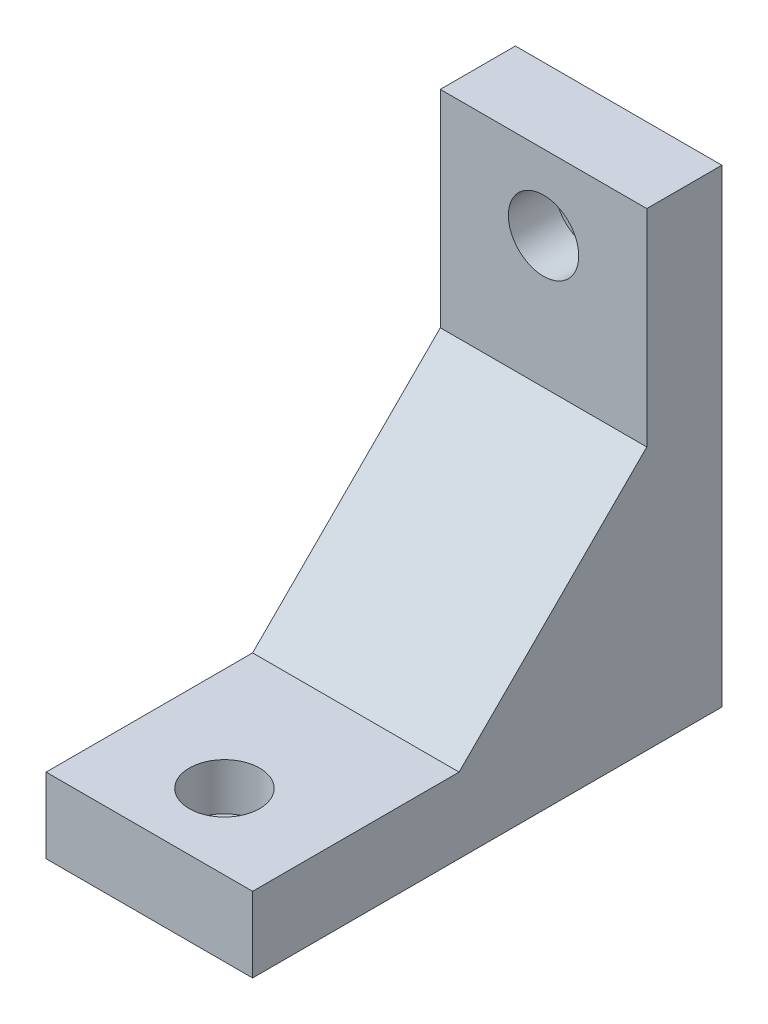
ISO-10303-21;
HEADER;
FILE_DESCRIPTION(('STEP AP214'),'2;1');
FILE_NAME('part.step','',(''),(''),'','','');
FILE_SCHEMA(('AUTOMOTIVE_DESIGN { 1 0 10303 214 1 1 1 1 }'));
ENDSEC;
DATA;
#1=APPLICATION_CONTEXT('core data for automotive mechanical design processes');
#2=APPLICATION_PROTOCOL_DEFINITION('international standard','automotive_design',2000,#1);
#3=PRODUCT_CONTEXT('',#1,'mechanical');
#4=PRODUCT('Part','Part','',(#3));
#5=PRODUCT_RELATED_PRODUCT_CATEGORY('part','',(#4));
#6=PRODUCT_DEFINITION_FORMATION('','',#4);
#7=PRODUCT_DEFINITION_CONTEXT('part definition',#1,'design');
#8=PRODUCT_DEFINITION('design','',#6,#7);
#9=PRODUCT_DEFINITION_SHAPE('','',#8);
#10=(LENGTH_UNIT() NAMED_UNIT(*) SI_UNIT(.MILLI.,.METRE.));
#11=(NAMED_UNIT(*) PLANE_ANGLE_UNIT() SI_UNIT($,.RADIAN.));
#12=(NAMED_UNIT(*) SI_UNIT($,.STERADIAN.) SOLID_ANGLE_UNIT());
#13=UNCERTAINTY_MEASURE_WITH_UNIT(LENGTH_MEASURE(1.E-05),#10,'distance_accuracy_value','');
#14=(GEOMETRIC_REPRESENTATION_CONTEXT(3) GLOBAL_UNCERTAINTY_ASSIGNED_CONTEXT((#13)) GLOBAL_UNIT_ASSIGNED_CONTEXT((#10,
#11,#12)) REPRESENTATION_CONTEXT('',''));
#15=CARTESIAN_POINT('',(0.,0.,0.));
#16=DIRECTION('',(0.,0.,1.));
#17=DIRECTION('',(1.,0.,0.));
#18=AXIS2_PLACEMENT_3D('',#15,#16,#17);
#19=CARTESIAN_POINT('',(22.,42.,0.));
#20=DIRECTION('',(0.,0.,-1.));
#21=DIRECTION('',(0.,1.,0.));
#22=AXIS2_PLACEMENT_3D('',#19,#20,#21);
#23=PLANE('',#22);
#24=CARTESIAN_POINT('',(11.,34.,0.));
#25=DIRECTION('',(0.,0.,1.));
#26=DIRECTION('',(1.,0.,0.));
#27=AXIS2_PLACEMENT_3D('',#24,#25,#26);
#28=CIRCLE('',#27,3.75);
#29=CARTESIAN_POINT('',(14.75,34.,0.));
#30=VERTEX_POINT('',#29);
#31=EDGE_CURVE('E185',#30,#30,#28,.T.);
#32=ORIENTED_EDGE('',*,*,#31,.F.);
#33=EDGE_LOOP('',(#32));
#34=FACE_BOUND('',#33,.T.);
#35=DIRECTION('',(0.,-1.,0.));
#36=VECTOR('',#35,1.);
#37=CARTESIAN_POINT('',(0.,42.,0.));
#38=LINE('',#37,#36);
#39=CARTESIAN_POINT('',(0.,42.,0.));
#40=VERTEX_POINT('',#39);
#41=CARTESIAN_POINT('',(0.,20.,0.));
#42=VERTEX_POINT('',#41);
#43=EDGE_CURVE('E150',#40,#42,#38,.T.);
#44=ORIENTED_EDGE('',*,*,#43,.T.);
#45=DIRECTION('',(1.,0.,0.));
#46=VECTOR('',#45,1.);
#47=CARTESIAN_POINT('',(22.,20.,0.));
#48=LINE('',#47,#46);
#49=CARTESIAN_POINT('',(22.,20.,0.));
#50=VERTEX_POINT('',#49);
#51=EDGE_CURVE('E63',#42,#50,#48,.T.);
#52=ORIENTED_EDGE('',*,*,#51,.T.);
#53=DIRECTION('',(0.,-1.,0.));
#54=VECTOR('',#53,1.);
#55=CARTESIAN_POINT('',(22.,42.,0.));
#56=LINE('',#55,#54);
#57=CARTESIAN_POINT('',(22.,42.,0.));
#58=VERTEX_POINT('',#57);
#59=EDGE_CURVE('E117',#58,#50,#56,.T.);
#60=ORIENTED_EDGE('',*,*,#59,.F.);
#61=DIRECTION('',(-1.,0.,0.));
#62=VECTOR('',#61,1.);
#63=CARTESIAN_POINT('',(22.,42.,0.));
#64=LINE('',#63,#62);
#65=EDGE_CURVE('E148',#58,#40,#64,.T.);
#66=ORIENTED_EDGE('',*,*,#65,.T.);
#67=EDGE_LOOP('',(#44,#52,#60,#66));
#68=FACE_BOUND('',#67,.T.);
#69=ADVANCED_FACE('F50',(#34,#68),#23,.F.);
#70=CARTESIAN_POINT('',(22.,0.,0.));
#71=DIRECTION('',(0.,-1.,0.));
#72=DIRECTION('',(0.,0.,-1.));
#73=AXIS2_PLACEMENT_3D('',#70,#71,#72);
#74=PLANE('',#73);
#75=CARTESIAN_POINT('',(11.,0.,34.));
#76=DIRECTION('',(0.,1.,0.));
#77=DIRECTION('',(0.,0.,1.));
#78=AXIS2_PLACEMENT_3D('',#75,#76,#77);
#79=CIRCLE('',#78,3.75);
#80=CARTESIAN_POINT('',(11.,0.,37.75));
#81=VERTEX_POINT('',#80);
#82=EDGE_CURVE('E187',#81,#81,#79,.T.);
#83=ORIENTED_EDGE('',*,*,#82,.F.);
#84=EDGE_LOOP('',(#83));
#85=FACE_BOUND('',#84,.T.);
#86=DIRECTION('',(0.,0.,1.));
#87=VECTOR('',#86,1.);
#88=CARTESIAN_POINT('',(22.,0.,0.));
#89=LINE('',#88,#87);
#90=CARTESIAN_POINT('',(22.,0.,20.0000000000002));
#91=VERTEX_POINT('',#90);
#92=CARTESIAN_POINT('',(22.,0.,42.));
#93=VERTEX_POINT('',#92);
#94=EDGE_CURVE('E110',#91,#93,#89,.T.);
#95=ORIENTED_EDGE('',*,*,#94,.F.);
#96=DIRECTION('',(-1.,0.,0.));
#97=VECTOR('',#96,1.);
#98=CARTESIAN_POINT('',(0.,0.,20.0000000000002));
#99=LINE('',#98,#97);
#100=CARTESIAN_POINT('',(0.,0.,20.0000000000002));
#101=VERTEX_POINT('',#100);
#102=EDGE_CURVE('E130',#91,#101,#99,.T.);
#103=ORIENTED_EDGE('',*,*,#102,.T.);
#104=DIRECTION('',(0.,0.,1.));
#105=VECTOR('',#104,1.);
#106=CARTESIAN_POINT('',(0.,0.,0.));
#107=LINE('',#106,#105);
#108=CARTESIAN_POINT('',(0.,0.,42.));
#109=VERTEX_POINT('',#108);
#110=EDGE_CURVE('E125',#101,#109,#107,.T.);
#111=ORIENTED_EDGE('',*,*,#110,.T.);
#112=DIRECTION('',(-1.,0.,0.));
#113=VECTOR('',#112,1.);
#114=CARTESIAN_POINT('',(22.,0.,42.));
#115=LINE('',#114,#113);
#116=EDGE_CURVE('E122',#93,#109,#115,.T.);
#117=ORIENTED_EDGE('',*,*,#116,.F.);
#118=EDGE_LOOP('',(#95,#103,#111,#117));
#119=FACE_BOUND('',#118,.T.);
#120=ADVANCED_FACE('F124',(#85,#119),#74,.F.);
#121=CARTESIAN_POINT('',(22.,0.,42.));
#122=DIRECTION('',(0.,0.,-1.));
#123=DIRECTION('',(-1.,0.,0.));
#124=AXIS2_PLACEMENT_3D('',#121,#122,#123);
#125=PLANE('',#124);
#126=DIRECTION('',(0.,-1.,0.));
#127=VECTOR('',#126,1.);
#128=CARTESIAN_POINT('',(0.,0.,42.));
#129=LINE('',#128,#127);
#130=CARTESIAN_POINT('',(0.,-8.,42.));
#131=VERTEX_POINT('',#130);
#132=EDGE_CURVE('E153',#109,#131,#129,.T.);
#133=ORIENTED_EDGE('',*,*,#132,.T.);
#134=DIRECTION('',(-1.,0.,0.));
#135=VECTOR('',#134,1.);
#136=CARTESIAN_POINT('',(22.,-8.,42.));
#137=LINE('',#136,#135);
#138=CARTESIAN_POINT('',(22.,-8.,42.));
#139=VERTEX_POINT('',#138);
#140=EDGE_CURVE('E126',#139,#131,#137,.T.);
#141=ORIENTED_EDGE('',*,*,#140,.F.);
#142=DIRECTION('',(0.,-1.,0.));
#143=VECTOR('',#142,1.);
#144=CARTESIAN_POINT('',(22.,0.,42.));
#145=LINE('',#144,#143);
#146=EDGE_CURVE('E112',#93,#139,#145,.T.);
#147=ORIENTED_EDGE('',*,*,#146,.F.);
#148=ORIENTED_EDGE('',*,*,#116,.T.);
#149=EDGE_LOOP('',(#133,#141,#147,#148));
#150=FACE_BOUND('',#149,.T.);
#151=ADVANCED_FACE('F128',(#150),#125,.F.);
#152=CARTESIAN_POINT('',(22.,-8.,42.));
#153=DIRECTION('',(0.,1.,0.));
#154=DIRECTION('',(0.,0.,1.));
#155=AXIS2_PLACEMENT_3D('',#152,#153,#154);
#156=PLANE('',#155);
#157=CARTESIAN_POINT('',(11.,-8.,34.));
#158=DIRECTION('',(0.,1.,0.));
#159=DIRECTION('',(0.,0.,1.));
#160=AXIS2_PLACEMENT_3D('',#157,#158,#159);
#161=CIRCLE('',#160,2.4);
#162=CARTESIAN_POINT('',(11.,-8.,36.4));
#163=VERTEX_POINT('',#162);
#164=EDGE_CURVE('E184',#163,#163,#161,.T.);
#165=ORIENTED_EDGE('',*,*,#164,.T.);
#166=EDGE_LOOP('',(#165));
#167=FACE_BOUND('',#166,.T.);
#168=DIRECTION('',(0.,0.,-1.));
#169=VECTOR('',#168,1.);
#170=CARTESIAN_POINT('',(0.,-8.,42.));
#171=LINE('',#170,#169);
#172=CARTESIAN_POINT('',(0.,-8.00000000000001,-7.99999999999999));
#173=VERTEX_POINT('',#172);
#174=EDGE_CURVE('E156',#131,#173,#171,.T.);
#175=ORIENTED_EDGE('',*,*,#174,.T.);
#176=DIRECTION('',(-1.,0.,0.));
#177=VECTOR('',#176,1.);
#178=CARTESIAN_POINT('',(22.,-8.00000000000001,-7.99999999999999));
#179=LINE('',#178,#177);
#180=CARTESIAN_POINT('',(22.,-8.00000000000001,-7.99999999999999));
#181=VERTEX_POINT('',#180);
#182=EDGE_CURVE('E175',#181,#173,#179,.T.);
#183=ORIENTED_EDGE('',*,*,#182,.F.);
#184=DIRECTION('',(0.,0.,-1.));
#185=VECTOR('',#184,1.);
#186=CARTESIAN_POINT('',(22.,-8.,42.));
#187=LINE('',#186,#185);
#188=EDGE_CURVE('E133',#139,#181,#187,.T.);
#189=ORIENTED_EDGE('',*,*,#188,.F.);
#190=ORIENTED_EDGE('',*,*,#140,.T.);
#191=EDGE_LOOP('',(#175,#183,#189,#190));
#192=FACE_BOUND('',#191,.T.);
#193=ADVANCED_FACE('F200',(#167,#192),#156,.F.);
#194=CARTESIAN_POINT('',(22.,-8.00000000000001,-7.99999999999999));
#195=DIRECTION('',(0.,0.,1.));
#196=DIRECTION('',(0.,-1.,0.));
#197=AXIS2_PLACEMENT_3D('',#194,#195,#196);
#198=PLANE('',#197);
#199=CARTESIAN_POINT('',(11.,34.,-8.));
#200=DIRECTION('',(0.,0.,1.));
#201=DIRECTION('',(0.,-1.,0.));
#202=AXIS2_PLACEMENT_3D('',#199,#200,#201);
#203=CIRCLE('',#202,2.4);
#204=CARTESIAN_POINT('',(11.,31.6,-8.));
#205=VERTEX_POINT('',#204);
#206=EDGE_CURVE('E180',#205,#205,#203,.T.);
#207=ORIENTED_EDGE('',*,*,#206,.T.);
#208=EDGE_LOOP('',(#207));
#209=FACE_BOUND('',#208,.T.);
#210=DIRECTION('',(0.,1.,0.));
#211=VECTOR('',#210,1.);
#212=CARTESIAN_POINT('',(0.,-8.00000000000001,-7.99999999999999));
#213=LINE('',#212,#211);
#214=CARTESIAN_POINT('',(0.,42.,-8.));
#215=VERTEX_POINT('',#214);
#216=EDGE_CURVE('E157',#173,#215,#213,.T.);
#217=ORIENTED_EDGE('',*,*,#216,.T.);
#218=DIRECTION('',(-1.,0.,0.));
#219=VECTOR('',#218,1.);
#220=CARTESIAN_POINT('',(22.,42.,-8.));
#221=LINE('',#220,#219);
#222=CARTESIAN_POINT('',(22.,42.,-8.));
#223=VERTEX_POINT('',#222);
#224=EDGE_CURVE('E169',#223,#215,#221,.T.);
#225=ORIENTED_EDGE('',*,*,#224,.F.);
#226=DIRECTION('',(0.,1.,0.));
#227=VECTOR('',#226,1.);
#228=CARTESIAN_POINT('',(22.,-8.00000000000001,-7.99999999999999));
#229=LINE('',#228,#227);
#230=EDGE_CURVE('E139',#181,#223,#229,.T.);
#231=ORIENTED_EDGE('',*,*,#230,.F.);
#232=ORIENTED_EDGE('',*,*,#182,.T.);
#233=EDGE_LOOP('',(#217,#225,#231,#232));
#234=FACE_BOUND('',#233,.T.);
#235=ADVANCED_FACE('F206',(#209,#234),#198,.F.);
#236=CARTESIAN_POINT('',(22.,42.,-8.));
#237=DIRECTION('',(0.,-1.,0.));
#238=DIRECTION('',(0.,0.,-1.));
#239=AXIS2_PLACEMENT_3D('',#236,#237,#238);
#240=PLANE('',#239);
#241=DIRECTION('',(0.,0.,1.));
#242=VECTOR('',#241,1.);
#243=CARTESIAN_POINT('',(0.,42.,-8.));
#244=LINE('',#243,#242);
#245=EDGE_CURVE('E165',#215,#40,#244,.T.);
#246=ORIENTED_EDGE('',*,*,#245,.T.);
#247=ORIENTED_EDGE('',*,*,#65,.F.);
#248=DIRECTION('',(0.,0.,1.));
#249=VECTOR('',#248,1.);
#250=CARTESIAN_POINT('',(22.,42.,-8.));
#251=LINE('',#250,#249);
#252=EDGE_CURVE('E141',#223,#58,#251,.T.);
#253=ORIENTED_EDGE('',*,*,#252,.F.);
#254=ORIENTED_EDGE('',*,*,#224,.T.);
#255=EDGE_LOOP('',(#246,#247,#253,#254));
#256=FACE_BOUND('',#255,.T.);
#257=ADVANCED_FACE('F207',(#256),#240,.F.);
#258=CARTESIAN_POINT('',(22.,0.,0.));
#259=DIRECTION('',(-1.,0.,0.));
#260=DIRECTION('',(0.,0.,1.));
#261=AXIS2_PLACEMENT_3D('',#258,#259,#260);
#262=PLANE('',#261);
#263=ORIENTED_EDGE('',*,*,#59,.T.);
#264=DIRECTION('',(0.,0.707106781186544,-0.707106781186551));
#265=VECTOR('',#264,1.);
#266=CARTESIAN_POINT('',(22.,10.0000000000001,9.99999999999998));
#267=LINE('',#266,#265);
#268=EDGE_CURVE('E11',#50,#91,#267,.F.);
#269=ORIENTED_EDGE('',*,*,#268,.T.);
#270=ORIENTED_EDGE('',*,*,#94,.T.);
#271=ORIENTED_EDGE('',*,*,#146,.T.);
#272=ORIENTED_EDGE('',*,*,#188,.T.);
#273=ORIENTED_EDGE('',*,*,#230,.T.);
#274=ORIENTED_EDGE('',*,*,#252,.T.);
#275=EDGE_LOOP('',(#263,#269,#270,#271,#272,#273,#274));
#276=FACE_BOUND('',#275,.T.);
#277=ADVANCED_FACE('F108',(#276),#262,.F.);
#278=CARTESIAN_POINT('',(0.,0.,0.));
#279=DIRECTION('',(-1.,0.,0.));
#280=DIRECTION('',(0.,0.,1.));
#281=AXIS2_PLACEMENT_3D('',#278,#279,#280);
#282=PLANE('',#281);
#283=ORIENTED_EDGE('',*,*,#43,.F.);
#284=ORIENTED_EDGE('',*,*,#245,.F.);
#285=ORIENTED_EDGE('',*,*,#216,.F.);
#286=ORIENTED_EDGE('',*,*,#174,.F.);
#287=ORIENTED_EDGE('',*,*,#132,.F.);
#288=ORIENTED_EDGE('',*,*,#110,.F.);
#289=DIRECTION('',(0.,-0.707106781186544,0.707106781186551));
#290=VECTOR('',#289,1.);
#291=CARTESIAN_POINT('',(0.,0.,20.0000000000002));
#292=LINE('',#291,#290);
#293=EDGE_CURVE('E60',#101,#42,#292,.F.);
#294=ORIENTED_EDGE('',*,*,#293,.T.);
#295=EDGE_LOOP('',(#283,#284,#285,#286,#287,#288,#294));
#296=FACE_BOUND('',#295,.T.);
#297=ADVANCED_FACE('F193',(#296),#282,.T.);
#298=CARTESIAN_POINT('',(11.,34.,-5.));
#299=DIRECTION('',(0.,0.,1.));
#300=DIRECTION('',(1.,0.,0.));
#301=AXIS2_PLACEMENT_3D('',#298,#299,#300);
#302=CYLINDRICAL_SURFACE('',#301,3.75);
#303=CARTESIAN_POINT('',(11.,34.,-5.));
#304=DIRECTION('',(0.,0.,1.));
#305=DIRECTION('',(1.,0.,0.));
#306=AXIS2_PLACEMENT_3D('',#303,#304,#305);
#307=CIRCLE('',#306,3.75);
#308=CARTESIAN_POINT('',(14.75,34.,-5.));
#309=VERTEX_POINT('',#308);
#310=EDGE_CURVE('E147',#309,#309,#307,.T.);
#311=ORIENTED_EDGE('',*,*,#310,.F.);
#312=EDGE_LOOP('',(#311));
#313=FACE_BOUND('',#312,.T.);
#314=ORIENTED_EDGE('',*,*,#31,.T.);
#315=EDGE_LOOP('',(#314));
#316=FACE_BOUND('',#315,.T.);
#317=ADVANCED_FACE('F268',(#313,#316),#302,.F.);
#318=CARTESIAN_POINT('',(11.,34.,-5.));
#319=DIRECTION('',(0.,0.,1.));
#320=DIRECTION('',(1.,0.,0.));
#321=AXIS2_PLACEMENT_3D('',#318,#319,#320);
#322=PLANE('',#321);
#323=CARTESIAN_POINT('',(11.,34.,-5.));
#324=DIRECTION('',(0.,0.,1.));
#325=DIRECTION('',(1.,0.,0.));
#326=AXIS2_PLACEMENT_3D('',#323,#324,#325);
#327=CIRCLE('',#326,2.4);
#328=CARTESIAN_POINT('',(13.4,34.,-5.));
#329=VERTEX_POINT('',#328);
#330=EDGE_CURVE('E181',#329,#329,#327,.T.);
#331=ORIENTED_EDGE('',*,*,#330,.F.);
#332=EDGE_LOOP('',(#331));
#333=FACE_BOUND('',#332,.T.);
#334=ORIENTED_EDGE('',*,*,#310,.T.);
#335=EDGE_LOOP('',(#334));
#336=FACE_BOUND('',#335,.T.);
#337=ADVANCED_FACE('F275',(#333,#336),#322,.T.);
#338=CARTESIAN_POINT('',(11.,34.,-10.));
#339=DIRECTION('',(0.,0.,1.));
#340=DIRECTION('',(1.,0.,0.));
#341=AXIS2_PLACEMENT_3D('',#338,#339,#340);
#342=CYLINDRICAL_SURFACE('',#341,2.4);
#343=ORIENTED_EDGE('',*,*,#330,.T.);
#344=EDGE_LOOP('',(#343));
#345=FACE_BOUND('',#344,.T.);
#346=ORIENTED_EDGE('',*,*,#206,.F.);
#347=EDGE_LOOP('',(#346));
#348=FACE_BOUND('',#347,.T.);
#349=ADVANCED_FACE('F243',(#345,#348),#342,.F.);
#350=CARTESIAN_POINT('',(11.,-5.,34.));
#351=DIRECTION('',(0.,1.,0.));
#352=DIRECTION('',(0.,0.,1.));
#353=AXIS2_PLACEMENT_3D('',#350,#351,#352);
#354=CYLINDRICAL_SURFACE('',#353,3.75);
#355=CARTESIAN_POINT('',(11.,-5.,34.));
#356=DIRECTION('',(0.,1.,0.));
#357=DIRECTION('',(0.,0.,1.));
#358=AXIS2_PLACEMENT_3D('',#355,#356,#357);
#359=CIRCLE('',#358,3.75);
#360=CARTESIAN_POINT('',(11.,-5.,37.75));
#361=VERTEX_POINT('',#360);
#362=EDGE_CURVE('E222',#361,#361,#359,.T.);
#363=ORIENTED_EDGE('',*,*,#362,.F.);
#364=EDGE_LOOP('',(#363));
#365=FACE_BOUND('',#364,.T.);
#366=ORIENTED_EDGE('',*,*,#82,.T.);
#367=EDGE_LOOP('',(#366));
#368=FACE_BOUND('',#367,.T.);
#369=ADVANCED_FACE('F236',(#365,#368),#354,.F.);
#370=CARTESIAN_POINT('',(11.,-5.,34.));
#371=DIRECTION('',(0.,1.,0.));
#372=DIRECTION('',(0.,0.,1.));
#373=AXIS2_PLACEMENT_3D('',#370,#371,#372);
#374=PLANE('',#373);
#375=CARTESIAN_POINT('',(11.,-5.,34.));
#376=DIRECTION('',(0.,1.,0.));
#377=DIRECTION('',(0.,0.,1.));
#378=AXIS2_PLACEMENT_3D('',#375,#376,#377);
#379=CIRCLE('',#378,2.4);
#380=CARTESIAN_POINT('',(11.,-5.,36.4));
#381=VERTEX_POINT('',#380);
#382=EDGE_CURVE('E188',#381,#381,#379,.T.);
#383=ORIENTED_EDGE('',*,*,#382,.F.);
#384=EDGE_LOOP('',(#383));
#385=FACE_BOUND('',#384,.T.);
#386=ORIENTED_EDGE('',*,*,#362,.T.);
#387=EDGE_LOOP('',(#386));
#388=FACE_BOUND('',#387,.T.);
#389=ADVANCED_FACE('F233',(#385,#388),#374,.T.);
#390=CARTESIAN_POINT('',(11.,-10.,34.));
#391=DIRECTION('',(0.,1.,0.));
#392=DIRECTION('',(0.,0.,1.));
#393=AXIS2_PLACEMENT_3D('',#390,#391,#392);
#394=CYLINDRICAL_SURFACE('',#393,2.4);
#395=ORIENTED_EDGE('',*,*,#382,.T.);
#396=EDGE_LOOP('',(#395));
#397=FACE_BOUND('',#396,.T.);
#398=ORIENTED_EDGE('',*,*,#164,.F.);
#399=EDGE_LOOP('',(#398));
#400=FACE_BOUND('',#399,.T.);
#401=ADVANCED_FACE('F234',(#397,#400),#394,.F.);
#402=CARTESIAN_POINT('',(22.,0.,20.0000000000002));
#403=DIRECTION('',(0.,0.707106781186551,0.707106781186544));
#404=DIRECTION('',(1.,0.,0.));
#405=AXIS2_PLACEMENT_3D('',#402,#403,#404);
#406=PLANE('',#405);
#407=ORIENTED_EDGE('',*,*,#268,.F.);
#408=ORIENTED_EDGE('',*,*,#51,.F.);
#409=ORIENTED_EDGE('',*,*,#293,.F.);
#410=ORIENTED_EDGE('',*,*,#102,.F.);
#411=EDGE_LOOP('',(#407,#408,#409,#410));
#412=FACE_BOUND('',#411,.T.);
#413=ADVANCED_FACE('F49',(#412),#406,.T.);
#414=CLOSED_SHELL('',(#69,#120,#151,#193,#235,#257,#277,#297,#317,#337,#349,#369,#389,#401,#413));
#415=MANIFOLD_SOLID_BREP('B2',#414);
#416=ADVANCED_BREP_SHAPE_REPRESENTATION('',(#18,#415),#14);
#417=SHAPE_DEFINITION_REPRESENTATION(#9,#416);
ENDSEC;
END-ISO-10303-21;
